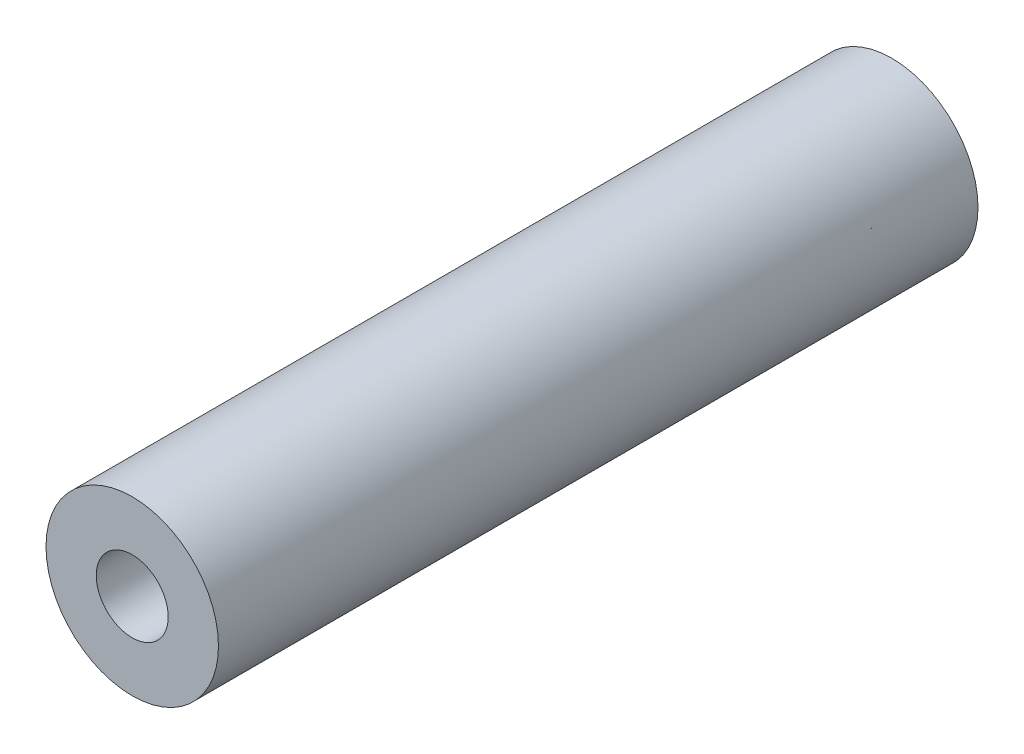
ISO-10303-21;
HEADER;
FILE_DESCRIPTION(('STEP AP214'),'2;1');
FILE_NAME('part.step','',(''),(''),'','','');
FILE_SCHEMA(('AUTOMOTIVE_DESIGN { 1 0 10303 214 1 1 1 1 }'));
ENDSEC;
DATA;
#1=APPLICATION_CONTEXT('core data for automotive mechanical design processes');
#2=APPLICATION_PROTOCOL_DEFINITION('international standard','automotive_design',2000,#1);
#3=PRODUCT_CONTEXT('',#1,'mechanical');
#4=PRODUCT('Part','Part','',(#3));
#5=PRODUCT_RELATED_PRODUCT_CATEGORY('part','',(#4));
#6=PRODUCT_DEFINITION_FORMATION('','',#4);
#7=PRODUCT_DEFINITION_CONTEXT('part definition',#1,'design');
#8=PRODUCT_DEFINITION('design','',#6,#7);
#9=PRODUCT_DEFINITION_SHAPE('','',#8);
#10=(LENGTH_UNIT() NAMED_UNIT(*) SI_UNIT(.MILLI.,.METRE.));
#11=(NAMED_UNIT(*) PLANE_ANGLE_UNIT() SI_UNIT($,.RADIAN.));
#12=(NAMED_UNIT(*) SI_UNIT($,.STERADIAN.) SOLID_ANGLE_UNIT());
#13=UNCERTAINTY_MEASURE_WITH_UNIT(LENGTH_MEASURE(1.E-05),#10,'distance_accuracy_value','');
#14=(GEOMETRIC_REPRESENTATION_CONTEXT(3) GLOBAL_UNCERTAINTY_ASSIGNED_CONTEXT((#13)) GLOBAL_UNIT_ASSIGNED_CONTEXT((#10,
#11,#12)) REPRESENTATION_CONTEXT('',''));
#15=CARTESIAN_POINT('',(0.,0.,0.));
#16=DIRECTION('',(0.,0.,1.));
#17=DIRECTION('',(1.,0.,0.));
#18=AXIS2_PLACEMENT_3D('',#15,#16,#17);
#19=CARTESIAN_POINT('',(0.,0.,-110.836968828428));
#20=DIRECTION('',(0.,0.,1.));
#21=DIRECTION('',(1.,0.,0.));
#22=AXIS2_PLACEMENT_3D('',#19,#20,#21);
#23=CYLINDRICAL_SURFACE('',#22,9.525);
#24=CARTESIAN_POINT('',(0.,0.,-83.89620046522));
#25=DIRECTION('',(0.,0.,1.));
#26=DIRECTION('',(0.,-1.,0.));
#27=AXIS2_PLACEMENT_3D('',#24,#25,#26);
#28=CIRCLE('',#27,9.525);
#29=CARTESIAN_POINT('',(0.,-9.525,-83.89620046522));
#30=VERTEX_POINT('',#29);
#31=EDGE_CURVE('E10',#30,#30,#28,.F.);
#32=ORIENTED_EDGE('',*,*,#31,.F.);
#33=EDGE_LOOP('',(#32));
#34=FACE_BOUND('',#33,.T.);
#35=CARTESIAN_POINT('',(0.,0.,0.));
#36=DIRECTION('',(0.,0.,1.));
#37=DIRECTION('',(1.,0.,0.));
#38=AXIS2_PLACEMENT_3D('',#35,#36,#37);
#39=CIRCLE('',#38,9.525);
#40=CARTESIAN_POINT('',(9.525,0.,0.));
#41=VERTEX_POINT('',#40);
#42=EDGE_CURVE('E48',#41,#41,#39,.T.);
#43=ORIENTED_EDGE('',*,*,#42,.F.);
#44=EDGE_LOOP('',(#43));
#45=FACE_BOUND('',#44,.T.);
#46=ADVANCED_FACE('F35',(#34,#45),#23,.T.);
#47=CARTESIAN_POINT('',(0.,0.,0.));
#48=DIRECTION('',(0.,0.,1.));
#49=DIRECTION('',(1.,0.,0.));
#50=AXIS2_PLACEMENT_3D('',#47,#48,#49);
#51=PLANE('',#50);
#52=CARTESIAN_POINT('',(0.,0.,0.));
#53=DIRECTION('',(0.,0.,1.));
#54=DIRECTION('',(1.,0.,0.));
#55=AXIS2_PLACEMENT_3D('',#52,#53,#54);
#56=CIRCLE('',#55,3.97509999999998);
#57=CARTESIAN_POINT('',(3.97509999999998,0.,0.));
#58=VERTEX_POINT('',#57);
#59=EDGE_CURVE('E50',#58,#58,#56,.T.);
#60=ORIENTED_EDGE('',*,*,#59,.F.);
#61=EDGE_LOOP('',(#60));
#62=FACE_BOUND('',#61,.T.);
#63=ORIENTED_EDGE('',*,*,#42,.T.);
#64=EDGE_LOOP('',(#63));
#65=FACE_BOUND('',#64,.T.);
#66=ADVANCED_FACE('F57',(#62,#65),#51,.T.);
#67=CARTESIAN_POINT('',(0.,0.,-110.836968828428));
#68=DIRECTION('',(0.,0.,1.));
#69=DIRECTION('',(1.,0.,0.));
#70=AXIS2_PLACEMENT_3D('',#67,#68,#69);
#71=CYLINDRICAL_SURFACE('',#70,3.97509999999998);
#72=CARTESIAN_POINT('',(0.,0.,-83.89620046522));
#73=DIRECTION('',(0.,0.,1.));
#74=DIRECTION('',(0.,-1.,0.));
#75=AXIS2_PLACEMENT_3D('',#72,#73,#74);
#76=CIRCLE('',#75,3.97509999999998);
#77=CARTESIAN_POINT('',(0.,-3.97509999999998,-83.89620046522));
#78=VERTEX_POINT('',#77);
#79=EDGE_CURVE('E38',#78,#78,#76,.F.);
#80=ORIENTED_EDGE('',*,*,#79,.T.);
#81=EDGE_LOOP('',(#80));
#82=FACE_BOUND('',#81,.T.);
#83=ORIENTED_EDGE('',*,*,#59,.T.);
#84=EDGE_LOOP('',(#83));
#85=FACE_BOUND('',#84,.T.);
#86=ADVANCED_FACE('F64',(#82,#85),#71,.F.);
#87=CARTESIAN_POINT('',(317.500000004093,12.7000004652194,-83.89620046522));
#88=DIRECTION('',(0.,0.,1.));
#89=DIRECTION('',(0.,1.,0.));
#90=AXIS2_PLACEMENT_3D('',#87,#88,#89);
#91=PLANE('',#90);
#92=ORIENTED_EDGE('',*,*,#31,.T.);
#93=EDGE_LOOP('',(#92));
#94=FACE_BOUND('',#93,.T.);
#95=ORIENTED_EDGE('',*,*,#79,.F.);
#96=EDGE_LOOP('',(#95));
#97=FACE_BOUND('',#96,.T.);
#98=ADVANCED_FACE('F69',(#94,#97),#91,.F.);
#99=CLOSED_SHELL('',(#46,#66,#86,#98));
#100=MANIFOLD_SOLID_BREP('B2',#99);
#101=ADVANCED_BREP_SHAPE_REPRESENTATION('',(#18,#100),#14);
#102=SHAPE_DEFINITION_REPRESENTATION(#9,#101);
ENDSEC;
END-ISO-10303-21;
